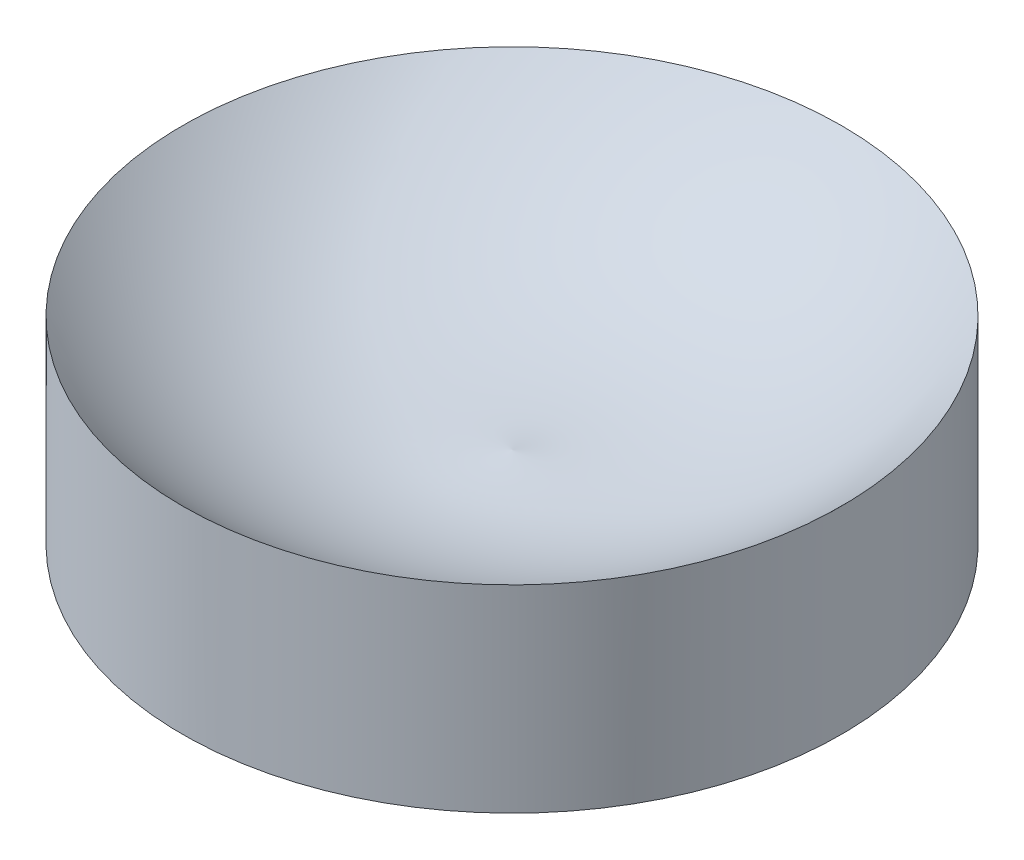
ISO-10303-21;
HEADER;
FILE_DESCRIPTION(('STEP AP214'),'2;1');
FILE_NAME('part.step','',(''),(''),'','','');
FILE_SCHEMA(('AUTOMOTIVE_DESIGN { 1 0 10303 214 1 1 1 1 }'));
ENDSEC;
DATA;
#1=APPLICATION_CONTEXT('core data for automotive mechanical design processes');
#2=APPLICATION_PROTOCOL_DEFINITION('international standard','automotive_design',2000,#1);
#3=PRODUCT_CONTEXT('',#1,'mechanical');
#4=PRODUCT('Part','Part','',(#3));
#5=PRODUCT_RELATED_PRODUCT_CATEGORY('part','',(#4));
#6=PRODUCT_DEFINITION_FORMATION('','',#4);
#7=PRODUCT_DEFINITION_CONTEXT('part definition',#1,'design');
#8=PRODUCT_DEFINITION('design','',#6,#7);
#9=PRODUCT_DEFINITION_SHAPE('','',#8);
#10=(LENGTH_UNIT() NAMED_UNIT(*) SI_UNIT(.MILLI.,.METRE.));
#11=(NAMED_UNIT(*) PLANE_ANGLE_UNIT() SI_UNIT($,.RADIAN.));
#12=(NAMED_UNIT(*) SI_UNIT($,.STERADIAN.) SOLID_ANGLE_UNIT());
#13=UNCERTAINTY_MEASURE_WITH_UNIT(LENGTH_MEASURE(1.E-05),#10,'distance_accuracy_value','');
#14=(GEOMETRIC_REPRESENTATION_CONTEXT(3) GLOBAL_UNCERTAINTY_ASSIGNED_CONTEXT((#13)) GLOBAL_UNIT_ASSIGNED_CONTEXT((#10,
#11,#12)) REPRESENTATION_CONTEXT('',''));
#15=CARTESIAN_POINT('',(0.,0.,0.));
#16=DIRECTION('',(0.,0.,1.));
#17=DIRECTION('',(1.,0.,0.));
#18=AXIS2_PLACEMENT_3D('',#15,#16,#17);
#19=CARTESIAN_POINT('',(0.,0.,0.));
#20=DIRECTION('',(0.,1.,0.));
#21=DIRECTION('',(0.,0.,1.));
#22=AXIS2_PLACEMENT_3D('',#19,#20,#21);
#23=PLANE('',#22);
#24=CARTESIAN_POINT('',(0.,0.,0.));
#25=DIRECTION('',(0.,-1.,0.));
#26=DIRECTION('',(0.,0.,-1.));
#27=AXIS2_PLACEMENT_3D('',#24,#25,#26);
#28=CIRCLE('',#27,5.);
#29=CARTESIAN_POINT('',(0.,0.,-5.));
#30=VERTEX_POINT('',#29);
#31=EDGE_CURVE('E11',#30,#30,#28,.T.);
#32=ORIENTED_EDGE('',*,*,#31,.T.);
#33=EDGE_LOOP('',(#32));
#34=FACE_BOUND('',#33,.T.);
#35=ADVANCED_FACE('F33',(#34),#23,.F.);
#36=CARTESIAN_POINT('',(0.,0.,0.));
#37=DIRECTION('',(0.,-1.,0.));
#38=DIRECTION('',(0.,0.,-1.));
#39=AXIS2_PLACEMENT_3D('',#36,#37,#38);
#40=CYLINDRICAL_SURFACE('',#39,5.);
#41=ORIENTED_EDGE('',*,*,#31,.F.);
#42=EDGE_LOOP('',(#41));
#43=FACE_BOUND('',#42,.T.);
#44=CARTESIAN_POINT('',(0.,3.,0.));
#45=DIRECTION('',(0.,-1.,0.));
#46=DIRECTION('',(0.,0.,-1.));
#47=AXIS2_PLACEMENT_3D('',#44,#45,#46);
#48=CIRCLE('',#47,5.);
#49=CARTESIAN_POINT('',(0.,3.,-5.));
#50=VERTEX_POINT('',#49);
#51=EDGE_CURVE('E39',#50,#50,#48,.T.);
#52=ORIENTED_EDGE('',*,*,#51,.T.);
#53=EDGE_LOOP('',(#52));
#54=FACE_BOUND('',#53,.T.);
#55=ADVANCED_FACE('F44',(#43,#54),#40,.T.);
#56=CARTESIAN_POINT('',(0.,1.23787298684894,0.));
#57=CARTESIAN_POINT('',(0.,0.884550938219455,2.90765399276218));
#58=CARTESIAN_POINT('',(0.,3.,5.));
#59=B_SPLINE_CURVE_WITH_KNOTS('',2,(#56,#57,#58),.UNSPECIFIED.,.F.,.F.,(3,3),(0.,1.),.UNSPECIFIED.);
#60=CARTESIAN_POINT('',(0.,0.,0.));
#61=DIRECTION('',(0.,-1.,0.));
#62=AXIS1_PLACEMENT('',#60,#61);
#63=SURFACE_OF_REVOLUTION('',#59,#62);
#64=ORIENTED_EDGE('',*,*,#51,.F.);
#65=EDGE_LOOP('',(#64));
#66=FACE_BOUND('',#65,.T.);
#67=CARTESIAN_POINT('',(0.,1.23787298684894,0.));
#68=VERTEX_POINT('',#67);
#69=VERTEX_LOOP('',#68);
#70=FACE_BOUND('',#69,.T.);
#71=ADVANCED_FACE('F42',(#66,#70),#63,.T.);
#72=CLOSED_SHELL('',(#35,#55,#71));
#73=MANIFOLD_SOLID_BREP('B2',#72);
#74=ADVANCED_BREP_SHAPE_REPRESENTATION('',(#18,#73),#14);
#75=SHAPE_DEFINITION_REPRESENTATION(#9,#74);
ENDSEC;
END-ISO-10303-21;
